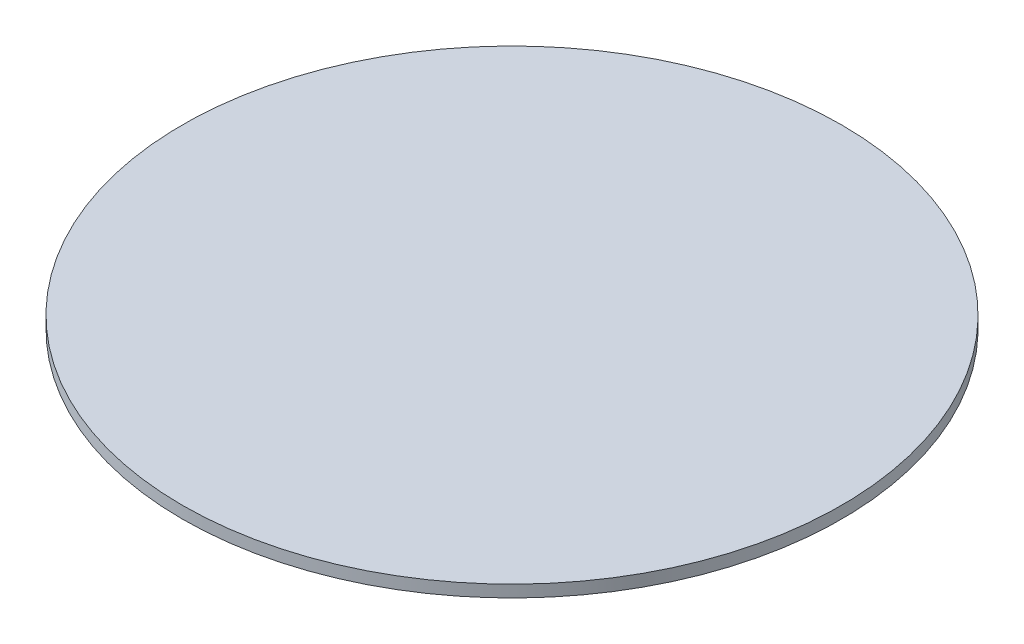
ISO-10303-21;
HEADER;
FILE_DESCRIPTION(('STEP AP214'),'2;1');
FILE_NAME('part.step','',(''),(''),'','','');
FILE_SCHEMA(('AUTOMOTIVE_DESIGN { 1 0 10303 214 1 1 1 1 }'));
ENDSEC;
DATA;
#1=APPLICATION_CONTEXT('core data for automotive mechanical design processes');
#2=APPLICATION_PROTOCOL_DEFINITION('international standard','automotive_design',2000,#1);
#3=PRODUCT_CONTEXT('',#1,'mechanical');
#4=PRODUCT('Part','Part','',(#3));
#5=PRODUCT_RELATED_PRODUCT_CATEGORY('part','',(#4));
#6=PRODUCT_DEFINITION_FORMATION('','',#4);
#7=PRODUCT_DEFINITION_CONTEXT('part definition',#1,'design');
#8=PRODUCT_DEFINITION('design','',#6,#7);
#9=PRODUCT_DEFINITION_SHAPE('','',#8);
#10=(LENGTH_UNIT() NAMED_UNIT(*) SI_UNIT(.MILLI.,.METRE.));
#11=(NAMED_UNIT(*) PLANE_ANGLE_UNIT() SI_UNIT($,.RADIAN.));
#12=(NAMED_UNIT(*) SI_UNIT($,.STERADIAN.) SOLID_ANGLE_UNIT());
#13=UNCERTAINTY_MEASURE_WITH_UNIT(LENGTH_MEASURE(1.E-05),#10,'distance_accuracy_value','');
#14=(GEOMETRIC_REPRESENTATION_CONTEXT(3) GLOBAL_UNCERTAINTY_ASSIGNED_CONTEXT((#13)) GLOBAL_UNIT_ASSIGNED_CONTEXT((#10,
#11,#12)) REPRESENTATION_CONTEXT('',''));
#15=CARTESIAN_POINT('',(0.,0.,0.));
#16=DIRECTION('',(0.,0.,1.));
#17=DIRECTION('',(1.,0.,0.));
#18=AXIS2_PLACEMENT_3D('',#15,#16,#17);
#19=CARTESIAN_POINT('',(350.,346.,-300.));
#20=DIRECTION('',(0.,-1.,0.));
#21=DIRECTION('',(0.,0.,-1.));
#22=AXIS2_PLACEMENT_3D('',#19,#20,#21);
#23=CYLINDRICAL_SURFACE('',#22,165.);
#24=CARTESIAN_POINT('',(350.,346.,-300.));
#25=DIRECTION('',(0.,1.,0.));
#26=DIRECTION('',(0.,0.,1.));
#27=AXIS2_PLACEMENT_3D('',#24,#25,#26);
#28=CIRCLE('',#27,165.);
#29=CARTESIAN_POINT('',(350.,346.,-135.));
#30=VERTEX_POINT('',#29);
#31=EDGE_CURVE('E10',#30,#30,#28,.T.);
#32=ORIENTED_EDGE('',*,*,#31,.F.);
#33=EDGE_LOOP('',(#32));
#34=FACE_BOUND('',#33,.T.);
#35=CARTESIAN_POINT('',(350.,340.,-300.));
#36=DIRECTION('',(0.,1.,0.));
#37=DIRECTION('',(0.,0.,1.));
#38=AXIS2_PLACEMENT_3D('',#35,#36,#37);
#39=CIRCLE('',#38,165.);
#40=CARTESIAN_POINT('',(350.,340.,-135.));
#41=VERTEX_POINT('',#40);
#42=EDGE_CURVE('E40',#41,#41,#39,.T.);
#43=ORIENTED_EDGE('',*,*,#42,.T.);
#44=EDGE_LOOP('',(#43));
#45=FACE_BOUND('',#44,.T.);
#46=ADVANCED_FACE('F37',(#34,#45),#23,.T.);
#47=CARTESIAN_POINT('',(350.,346.,-300.));
#48=DIRECTION('',(0.,1.,0.));
#49=DIRECTION('',(0.,0.,1.));
#50=AXIS2_PLACEMENT_3D('',#47,#48,#49);
#51=PLANE('',#50);
#52=ORIENTED_EDGE('',*,*,#31,.T.);
#53=EDGE_LOOP('',(#52));
#54=FACE_BOUND('',#53,.T.);
#55=ADVANCED_FACE('F52',(#54),#51,.T.);
#56=CARTESIAN_POINT('',(350.,340.,-300.));
#57=DIRECTION('',(0.,1.,0.));
#58=DIRECTION('',(0.,0.,1.));
#59=AXIS2_PLACEMENT_3D('',#56,#57,#58);
#60=PLANE('',#59);
#61=ORIENTED_EDGE('',*,*,#42,.F.);
#62=EDGE_LOOP('',(#61));
#63=FACE_BOUND('',#62,.T.);
#64=ADVANCED_FACE('F50',(#63),#60,.F.);
#65=CLOSED_SHELL('',(#46,#55,#64));
#66=MANIFOLD_SOLID_BREP('B2',#65);
#67=ADVANCED_BREP_SHAPE_REPRESENTATION('',(#18,#66),#14);
#68=SHAPE_DEFINITION_REPRESENTATION(#9,#67);
ENDSEC;
END-ISO-10303-21;
